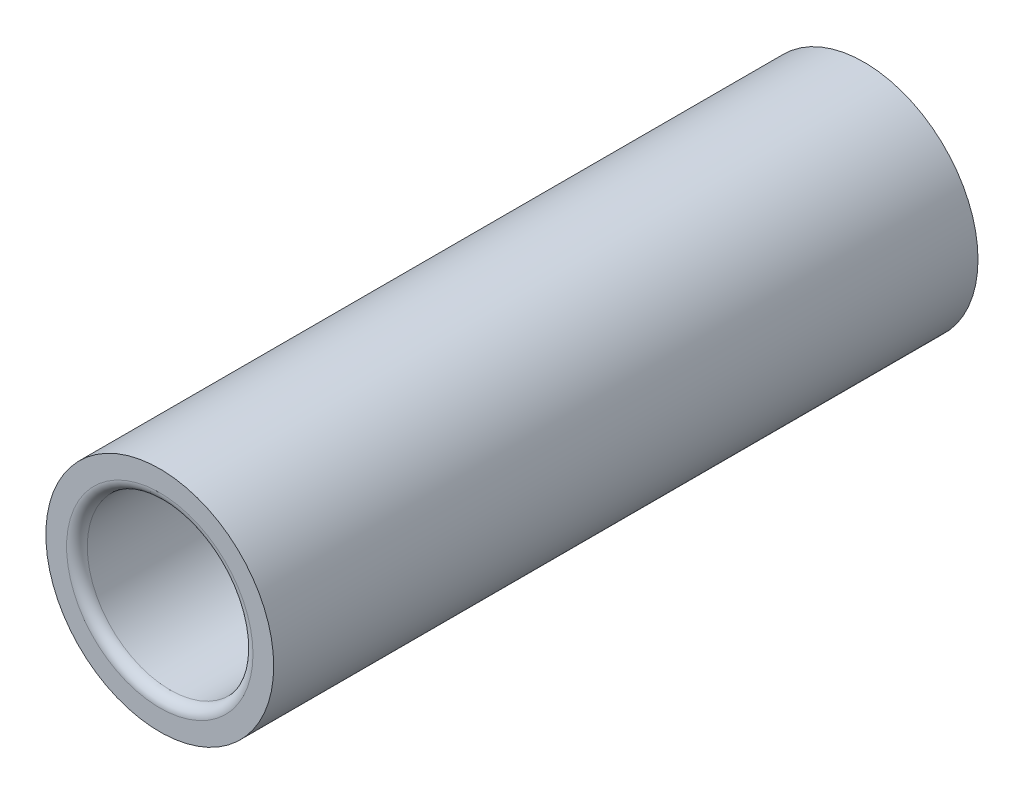
ISO-10303-21;
HEADER;
FILE_DESCRIPTION(('STEP AP214'),'2;1');
FILE_NAME('part.step','',(''),(''),'','','');
FILE_SCHEMA(('AUTOMOTIVE_DESIGN { 1 0 10303 214 1 1 1 1 }'));
ENDSEC;
DATA;
#1=APPLICATION_CONTEXT('core data for automotive mechanical design processes');
#2=APPLICATION_PROTOCOL_DEFINITION('international standard','automotive_design',2000,#1);
#3=PRODUCT_CONTEXT('',#1,'mechanical');
#4=PRODUCT('Part','Part','',(#3));
#5=PRODUCT_RELATED_PRODUCT_CATEGORY('part','',(#4));
#6=PRODUCT_DEFINITION_FORMATION('','',#4);
#7=PRODUCT_DEFINITION_CONTEXT('part definition',#1,'design');
#8=PRODUCT_DEFINITION('design','',#6,#7);
#9=PRODUCT_DEFINITION_SHAPE('','',#8);
#10=(LENGTH_UNIT() NAMED_UNIT(*) SI_UNIT(.MILLI.,.METRE.));
#11=(NAMED_UNIT(*) PLANE_ANGLE_UNIT() SI_UNIT($,.RADIAN.));
#12=(NAMED_UNIT(*) SI_UNIT($,.STERADIAN.) SOLID_ANGLE_UNIT());
#13=UNCERTAINTY_MEASURE_WITH_UNIT(LENGTH_MEASURE(1.E-05),#10,'distance_accuracy_value','');
#14=(GEOMETRIC_REPRESENTATION_CONTEXT(3) GLOBAL_UNCERTAINTY_ASSIGNED_CONTEXT((#13)) GLOBAL_UNIT_ASSIGNED_CONTEXT((#10,
#11,#12)) REPRESENTATION_CONTEXT('',''));
#15=CARTESIAN_POINT('',(0.,0.,0.));
#16=DIRECTION('',(0.,0.,1.));
#17=DIRECTION('',(1.,0.,0.));
#18=AXIS2_PLACEMENT_3D('',#15,#16,#17);
#19=CARTESIAN_POINT('',(0.,0.,34.));
#20=DIRECTION('',(0.,0.,1.));
#21=DIRECTION('',(1.,0.,0.));
#22=AXIS2_PLACEMENT_3D('',#19,#20,#21);
#23=PLANE('',#22);
#24=CARTESIAN_POINT('',(0.,0.,34.));
#25=DIRECTION('',(0.,0.,1.));
#26=DIRECTION('',(1.,0.,0.));
#27=AXIS2_PLACEMENT_3D('',#24,#25,#26);
#28=CIRCLE('',#27,9.);
#29=CARTESIAN_POINT('',(9.,0.,34.));
#30=VERTEX_POINT('',#29);
#31=EDGE_CURVE('E10',#30,#30,#28,.F.);
#32=ORIENTED_EDGE('',*,*,#31,.T.);
#33=EDGE_LOOP('',(#32));
#34=FACE_BOUND('',#33,.T.);
#35=CARTESIAN_POINT('',(0.,0.,34.));
#36=DIRECTION('',(0.,0.,1.));
#37=DIRECTION('',(1.,0.,0.));
#38=AXIS2_PLACEMENT_3D('',#35,#36,#37);
#39=CIRCLE('',#38,11.);
#40=CARTESIAN_POINT('',(11.,0.,34.));
#41=VERTEX_POINT('',#40);
#42=EDGE_CURVE('E54',#41,#41,#39,.T.);
#43=ORIENTED_EDGE('',*,*,#42,.T.);
#44=EDGE_LOOP('',(#43));
#45=FACE_BOUND('',#44,.T.);
#46=ADVANCED_FACE('F34',(#34,#45),#23,.T.);
#47=CARTESIAN_POINT('',(0.,0.,-34.));
#48=DIRECTION('',(0.,0.,1.));
#49=DIRECTION('',(1.,0.,0.));
#50=AXIS2_PLACEMENT_3D('',#47,#48,#49);
#51=PLANE('',#50);
#52=CARTESIAN_POINT('',(0.,0.,-34.));
#53=DIRECTION('',(0.,0.,1.));
#54=DIRECTION('',(1.,0.,0.));
#55=AXIS2_PLACEMENT_3D('',#52,#53,#54);
#56=CIRCLE('',#55,9.);
#57=CARTESIAN_POINT('',(9.,0.,-34.));
#58=VERTEX_POINT('',#57);
#59=EDGE_CURVE('E49',#58,#58,#56,.T.);
#60=ORIENTED_EDGE('',*,*,#59,.T.);
#61=EDGE_LOOP('',(#60));
#62=FACE_BOUND('',#61,.T.);
#63=CARTESIAN_POINT('',(0.,0.,-34.));
#64=DIRECTION('',(0.,0.,1.));
#65=DIRECTION('',(1.,0.,0.));
#66=AXIS2_PLACEMENT_3D('',#63,#64,#65);
#67=CIRCLE('',#66,11.);
#68=CARTESIAN_POINT('',(11.,0.,-34.));
#69=VERTEX_POINT('',#68);
#70=EDGE_CURVE('E55',#69,#69,#67,.T.);
#71=ORIENTED_EDGE('',*,*,#70,.F.);
#72=EDGE_LOOP('',(#71));
#73=FACE_BOUND('',#72,.T.);
#74=ADVANCED_FACE('F66',(#62,#73),#51,.F.);
#75=CARTESIAN_POINT('',(0.,0.,34.));
#76=DIRECTION('',(0.,0.,-1.));
#77=DIRECTION('',(-1.,0.,0.));
#78=AXIS2_PLACEMENT_3D('',#75,#76,#77);
#79=CYLINDRICAL_SURFACE('',#78,11.);
#80=ORIENTED_EDGE('',*,*,#42,.F.);
#81=EDGE_LOOP('',(#80));
#82=FACE_BOUND('',#81,.T.);
#83=ORIENTED_EDGE('',*,*,#70,.T.);
#84=EDGE_LOOP('',(#83));
#85=FACE_BOUND('',#84,.T.);
#86=ADVANCED_FACE('F62',(#82,#85),#79,.T.);
#87=CARTESIAN_POINT('',(0.,0.,34.));
#88=DIRECTION('',(0.,0.,-1.));
#89=DIRECTION('',(-1.,0.,0.));
#90=AXIS2_PLACEMENT_3D('',#87,#88,#89);
#91=CYLINDRICAL_SURFACE('',#90,8.);
#92=CARTESIAN_POINT('',(0.,0.,-33.));
#93=DIRECTION('',(0.,0.,1.));
#94=DIRECTION('',(1.,0.,0.));
#95=AXIS2_PLACEMENT_3D('',#92,#93,#94);
#96=CIRCLE('',#95,8.);
#97=CARTESIAN_POINT('',(8.,0.,-33.));
#98=VERTEX_POINT('',#97);
#99=EDGE_CURVE('E41',#98,#98,#96,.F.);
#100=ORIENTED_EDGE('',*,*,#99,.T.);
#101=EDGE_LOOP('',(#100));
#102=FACE_BOUND('',#101,.T.);
#103=CARTESIAN_POINT('',(0.,0.,33.));
#104=DIRECTION('',(0.,0.,1.));
#105=DIRECTION('',(1.,0.,0.));
#106=AXIS2_PLACEMENT_3D('',#103,#104,#105);
#107=CIRCLE('',#106,8.);
#108=CARTESIAN_POINT('',(8.,0.,33.));
#109=VERTEX_POINT('',#108);
#110=EDGE_CURVE('E45',#109,#109,#107,.T.);
#111=ORIENTED_EDGE('',*,*,#110,.T.);
#112=EDGE_LOOP('',(#111));
#113=FACE_BOUND('',#112,.T.);
#114=ADVANCED_FACE('F65',(#102,#113),#91,.F.);
#115=CARTESIAN_POINT('',(0.,0.,-33.));
#116=DIRECTION('',(0.,0.,1.));
#117=DIRECTION('',(1.,0.,0.));
#118=AXIS2_PLACEMENT_3D('',#115,#116,#117);
#119=TOROIDAL_SURFACE('',#118,9.,1.);
#120=ORIENTED_EDGE('',*,*,#99,.F.);
#121=EDGE_LOOP('',(#120));
#122=FACE_BOUND('',#121,.T.);
#123=ORIENTED_EDGE('',*,*,#59,.F.);
#124=EDGE_LOOP('',(#123));
#125=FACE_BOUND('',#124,.T.);
#126=ADVANCED_FACE('F78',(#122,#125),#119,.T.);
#127=CARTESIAN_POINT('',(0.,0.,33.));
#128=DIRECTION('',(0.,0.,1.));
#129=DIRECTION('',(1.,0.,0.));
#130=AXIS2_PLACEMENT_3D('',#127,#128,#129);
#131=TOROIDAL_SURFACE('',#130,9.,1.);
#132=ORIENTED_EDGE('',*,*,#31,.F.);
#133=EDGE_LOOP('',(#132));
#134=FACE_BOUND('',#133,.T.);
#135=ORIENTED_EDGE('',*,*,#110,.F.);
#136=EDGE_LOOP('',(#135));
#137=FACE_BOUND('',#136,.T.);
#138=ADVANCED_FACE('F36',(#134,#137),#131,.T.);
#139=CLOSED_SHELL('',(#46,#74,#86,#114,#126,#138));
#140=MANIFOLD_SOLID_BREP('B2',#139);
#141=ADVANCED_BREP_SHAPE_REPRESENTATION('',(#18,#140),#14);
#142=SHAPE_DEFINITION_REPRESENTATION(#9,#141);
ENDSEC;
END-ISO-10303-21;
